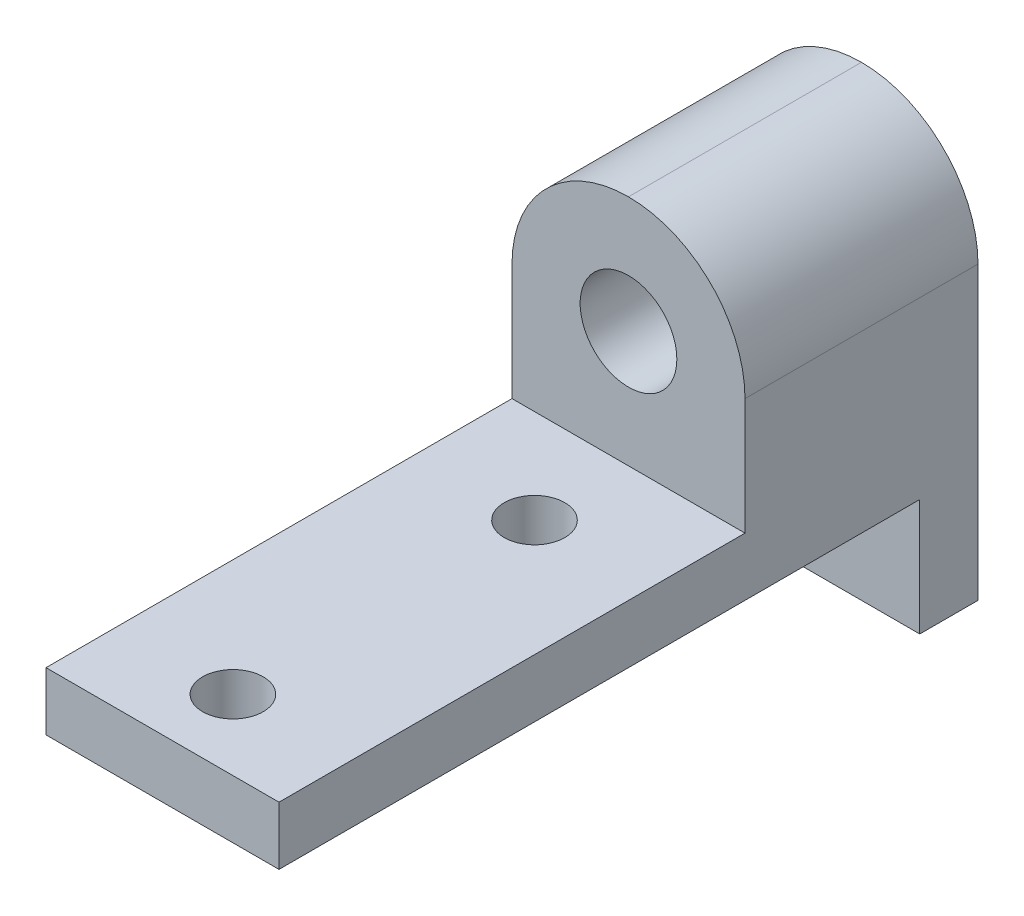
ISO-10303-21;
HEADER;
FILE_DESCRIPTION(('STEP AP214'),'2;1');
FILE_NAME('part.step','',(''),(''),'','','');
FILE_SCHEMA(('AUTOMOTIVE_DESIGN { 1 0 10303 214 1 1 1 1 }'));
ENDSEC;
DATA;
#1=APPLICATION_CONTEXT('core data for automotive mechanical design processes');
#2=APPLICATION_PROTOCOL_DEFINITION('international standard','automotive_design',2000,#1);
#3=PRODUCT_CONTEXT('',#1,'mechanical');
#4=PRODUCT('Part','Part','',(#3));
#5=PRODUCT_RELATED_PRODUCT_CATEGORY('part','',(#4));
#6=PRODUCT_DEFINITION_FORMATION('','',#4);
#7=PRODUCT_DEFINITION_CONTEXT('part definition',#1,'design');
#8=PRODUCT_DEFINITION('design','',#6,#7);
#9=PRODUCT_DEFINITION_SHAPE('','',#8);
#10=(LENGTH_UNIT() NAMED_UNIT(*) SI_UNIT(.MILLI.,.METRE.));
#11=(NAMED_UNIT(*) PLANE_ANGLE_UNIT() SI_UNIT($,.RADIAN.));
#12=(NAMED_UNIT(*) SI_UNIT($,.STERADIAN.) SOLID_ANGLE_UNIT());
#13=UNCERTAINTY_MEASURE_WITH_UNIT(LENGTH_MEASURE(1.E-05),#10,'distance_accuracy_value','');
#14=(GEOMETRIC_REPRESENTATION_CONTEXT(3) GLOBAL_UNCERTAINTY_ASSIGNED_CONTEXT((#13)) GLOBAL_UNIT_ASSIGNED_CONTEXT((#10,
#11,#12)) REPRESENTATION_CONTEXT('',''));
#15=CARTESIAN_POINT('',(0.,0.,0.));
#16=DIRECTION('',(0.,0.,1.));
#17=DIRECTION('',(1.,0.,0.));
#18=AXIS2_PLACEMENT_3D('',#15,#16,#17);
#19=CARTESIAN_POINT('',(0.,0.,0.));
#20=DIRECTION('',(0.,1.,0.));
#21=DIRECTION('',(0.,0.,1.));
#22=AXIS2_PLACEMENT_3D('',#19,#20,#21);
#23=PLANE('',#22);
#24=CARTESIAN_POINT('',(2.63414634146342,0.,46.221727325495));
#25=DIRECTION('',(0.,1.,0.));
#26=DIRECTION('',(0.,0.,1.));
#27=AXIS2_PLACEMENT_3D('',#24,#25,#26);
#28=CIRCLE('',#27,2.6);
#29=CARTESIAN_POINT('',(2.63414634146342,0.,48.821727325495));
#30=VERTEX_POINT('',#29);
#31=EDGE_CURVE('E135',#30,#30,#28,.T.);
#32=ORIENTED_EDGE('',*,*,#31,.T.);
#33=EDGE_LOOP('',(#32));
#34=FACE_BOUND('',#33,.T.);
#35=CARTESIAN_POINT('',(2.63414634146342,0.,72.1101674430074));
#36=DIRECTION('',(0.,1.,0.));
#37=DIRECTION('',(0.,0.,1.));
#38=AXIS2_PLACEMENT_3D('',#35,#36,#37);
#39=CIRCLE('',#38,2.6);
#40=CARTESIAN_POINT('',(2.63414634146342,0.,74.7101674430074));
#41=VERTEX_POINT('',#40);
#42=EDGE_CURVE('E138',#41,#41,#39,.T.);
#43=ORIENTED_EDGE('',*,*,#42,.T.);
#44=EDGE_LOOP('',(#43));
#45=FACE_BOUND('',#44,.T.);
#46=DIRECTION('',(-1.,0.,0.));
#47=VECTOR('',#46,1.);
#48=CARTESIAN_POINT('',(-7.36585365853658,0.,23.1541428107448));
#49=LINE('',#48,#47);
#50=CARTESIAN_POINT('',(12.6341463414634,0.,23.1541428107448));
#51=VERTEX_POINT('',#50);
#52=CARTESIAN_POINT('',(-7.36585365853658,0.,23.1541428107448));
#53=VERTEX_POINT('',#52);
#54=EDGE_CURVE('E53',#51,#53,#49,.T.);
#55=ORIENTED_EDGE('',*,*,#54,.F.);
#56=DIRECTION('',(0.,0.,-1.));
#57=VECTOR('',#56,1.);
#58=CARTESIAN_POINT('',(12.6341463414634,0.,8.15414281074482));
#59=LINE('',#58,#57);
#60=CARTESIAN_POINT('',(12.6341463414634,0.,78.1541428107448));
#61=VERTEX_POINT('',#60);
#62=EDGE_CURVE('E119',#61,#51,#59,.T.);
#63=ORIENTED_EDGE('',*,*,#62,.F.);
#64=DIRECTION('',(1.,0.,0.));
#65=VECTOR('',#64,1.);
#66=CARTESIAN_POINT('',(-7.36585365853658,0.,78.1541428107448));
#67=LINE('',#66,#65);
#68=CARTESIAN_POINT('',(-7.36585365853658,0.,78.1541428107448));
#69=VERTEX_POINT('',#68);
#70=EDGE_CURVE('E129',#69,#61,#67,.T.);
#71=ORIENTED_EDGE('',*,*,#70,.F.);
#72=DIRECTION('',(0.,0.,1.));
#73=VECTOR('',#72,1.);
#74=CARTESIAN_POINT('',(-7.36585365853658,0.,8.15414281074482));
#75=LINE('',#74,#73);
#76=EDGE_CURVE('E125',#53,#69,#75,.T.);
#77=ORIENTED_EDGE('',*,*,#76,.F.);
#78=EDGE_LOOP('',(#55,#63,#71,#77));
#79=FACE_BOUND('',#78,.T.);
#80=ADVANCED_FACE('F37',(#34,#45,#79),#23,.F.);
#81=CARTESIAN_POINT('',(-7.36585365853658,5.,8.15414281074482));
#82=DIRECTION('',(1.,0.,0.));
#83=DIRECTION('',(0.,0.,-1.));
#84=AXIS2_PLACEMENT_3D('',#81,#82,#83);
#85=PLANE('',#84);
#86=DIRECTION('',(0.,-1.,0.));
#87=VECTOR('',#86,1.);
#88=CARTESIAN_POINT('',(-7.36585365853658,25.,18.1541428107448));
#89=LINE('',#88,#87);
#90=CARTESIAN_POINT('',(-7.36585365853658,15.,18.1541428107448));
#91=VERTEX_POINT('',#90);
#92=CARTESIAN_POINT('',(-7.36585365853658,-10.,18.1541428107448));
#93=VERTEX_POINT('',#92);
#94=EDGE_CURVE('E171',#91,#93,#89,.T.);
#95=ORIENTED_EDGE('',*,*,#94,.T.);
#96=DIRECTION('',(0.,0.,-1.));
#97=VECTOR('',#96,1.);
#98=CARTESIAN_POINT('',(-7.36585365853658,-10.,18.1541428107448));
#99=LINE('',#98,#97);
#100=CARTESIAN_POINT('',(-7.36585365853658,-10.,23.1541428107448));
#101=VERTEX_POINT('',#100);
#102=EDGE_CURVE('E150',#101,#93,#99,.T.);
#103=ORIENTED_EDGE('',*,*,#102,.F.);
#104=DIRECTION('',(0.,1.,0.));
#105=VECTOR('',#104,1.);
#106=CARTESIAN_POINT('',(-7.36585365853658,-10.,23.1541428107448));
#107=LINE('',#106,#105);
#108=EDGE_CURVE('E160',#101,#53,#107,.T.);
#109=ORIENTED_EDGE('',*,*,#108,.T.);
#110=ORIENTED_EDGE('',*,*,#76,.T.);
#111=DIRECTION('',(0.,-1.,0.));
#112=VECTOR('',#111,1.);
#113=CARTESIAN_POINT('',(-7.36585365853658,5.,78.1541428107448));
#114=LINE('',#113,#112);
#115=CARTESIAN_POINT('',(-7.36585365853658,5.,78.1541428107448));
#116=VERTEX_POINT('',#115);
#117=EDGE_CURVE('E122',#116,#69,#114,.T.);
#118=ORIENTED_EDGE('',*,*,#117,.F.);
#119=DIRECTION('',(0.,0.,1.));
#120=VECTOR('',#119,1.);
#121=CARTESIAN_POINT('',(-7.36585365853658,5.,8.15414281074482));
#122=LINE('',#121,#120);
#123=CARTESIAN_POINT('',(-7.36585365853658,5.,38.1541428107448));
#124=VERTEX_POINT('',#123);
#125=EDGE_CURVE('E109',#124,#116,#122,.T.);
#126=ORIENTED_EDGE('',*,*,#125,.F.);
#127=DIRECTION('',(0.,-1.,0.));
#128=VECTOR('',#127,1.);
#129=CARTESIAN_POINT('',(-7.36585365853658,25.,38.1541428107448));
#130=LINE('',#129,#128);
#131=CARTESIAN_POINT('',(-7.36585365853658,15.,38.1541428107448));
#132=VERTEX_POINT('',#131);
#133=EDGE_CURVE('E177',#132,#124,#130,.T.);
#134=ORIENTED_EDGE('',*,*,#133,.F.);
#135=DIRECTION('',(0.,0.,1.));
#136=VECTOR('',#135,1.);
#137=CARTESIAN_POINT('',(-7.36585365853658,15.,18.1541428107448));
#138=LINE('',#137,#136);
#139=EDGE_CURVE('E11',#132,#91,#138,.F.);
#140=ORIENTED_EDGE('',*,*,#139,.T.);
#141=EDGE_LOOP('',(#95,#103,#109,#110,#118,#126,#134,#140));
#142=FACE_BOUND('',#141,.T.);
#143=ADVANCED_FACE('F123',(#142),#85,.F.);
#144=CARTESIAN_POINT('',(12.6341463414634,5.,8.15414281074482));
#145=DIRECTION('',(-1.,0.,0.));
#146=DIRECTION('',(0.,0.,1.));
#147=AXIS2_PLACEMENT_3D('',#144,#145,#146);
#148=PLANE('',#147);
#149=ORIENTED_EDGE('',*,*,#62,.T.);
#150=DIRECTION('',(0.,1.,0.));
#151=VECTOR('',#150,1.);
#152=CARTESIAN_POINT('',(12.6341463414634,-10.,23.1541428107448));
#153=LINE('',#152,#151);
#154=CARTESIAN_POINT('',(12.6341463414634,-10.,23.1541428107448));
#155=VERTEX_POINT('',#154);
#156=EDGE_CURVE('E163',#155,#51,#153,.T.);
#157=ORIENTED_EDGE('',*,*,#156,.F.);
#158=DIRECTION('',(0.,0.,1.));
#159=VECTOR('',#158,1.);
#160=CARTESIAN_POINT('',(12.6341463414634,-10.,18.1541428107448));
#161=LINE('',#160,#159);
#162=CARTESIAN_POINT('',(12.6341463414634,-10.,18.1541428107448));
#163=VERTEX_POINT('',#162);
#164=EDGE_CURVE('E156',#163,#155,#161,.T.);
#165=ORIENTED_EDGE('',*,*,#164,.F.);
#166=DIRECTION('',(0.,-1.,0.));
#167=VECTOR('',#166,1.);
#168=CARTESIAN_POINT('',(12.6341463414634,25.,18.1541428107448));
#169=LINE('',#168,#167);
#170=CARTESIAN_POINT('',(12.6341463414634,15.,18.1541428107448));
#171=VERTEX_POINT('',#170);
#172=EDGE_CURVE('E173',#171,#163,#169,.T.);
#173=ORIENTED_EDGE('',*,*,#172,.F.);
#174=DIRECTION('',(0.,0.,-1.));
#175=VECTOR('',#174,1.);
#176=CARTESIAN_POINT('',(12.6341463414634,15.,38.1541428107448));
#177=LINE('',#176,#175);
#178=CARTESIAN_POINT('',(12.6341463414634,15.,38.1541428107448));
#179=VERTEX_POINT('',#178);
#180=EDGE_CURVE('E188',#171,#179,#177,.F.);
#181=ORIENTED_EDGE('',*,*,#180,.T.);
#182=DIRECTION('',(0.,-1.,0.));
#183=VECTOR('',#182,1.);
#184=CARTESIAN_POINT('',(12.6341463414634,25.,38.1541428107448));
#185=LINE('',#184,#183);
#186=CARTESIAN_POINT('',(12.6341463414634,5.,38.1541428107448));
#187=VERTEX_POINT('',#186);
#188=EDGE_CURVE('E175',#179,#187,#185,.T.);
#189=ORIENTED_EDGE('',*,*,#188,.T.);
#190=DIRECTION('',(0.,0.,-1.));
#191=VECTOR('',#190,1.);
#192=CARTESIAN_POINT('',(12.6341463414634,5.,8.15414281074482));
#193=LINE('',#192,#191);
#194=CARTESIAN_POINT('',(12.6341463414634,5.,78.1541428107448));
#195=VERTEX_POINT('',#194);
#196=EDGE_CURVE('E118',#195,#187,#193,.T.);
#197=ORIENTED_EDGE('',*,*,#196,.F.);
#198=DIRECTION('',(0.,1.,0.));
#199=VECTOR('',#198,1.);
#200=CARTESIAN_POINT('',(12.6341463414634,0.,78.1541428107448));
#201=LINE('',#200,#199);
#202=EDGE_CURVE('E134',#61,#195,#201,.T.);
#203=ORIENTED_EDGE('',*,*,#202,.F.);
#204=EDGE_LOOP('',(#149,#157,#165,#173,#181,#189,#197,#203));
#205=FACE_BOUND('',#204,.T.);
#206=ADVANCED_FACE('F210',(#205),#148,.F.);
#207=CARTESIAN_POINT('',(0.,5.,0.));
#208=DIRECTION('',(0.,1.,0.));
#209=DIRECTION('',(0.,0.,1.));
#210=AXIS2_PLACEMENT_3D('',#207,#208,#209);
#211=PLANE('',#210);
#212=CARTESIAN_POINT('',(2.63414634146342,5.,46.221727325495));
#213=DIRECTION('',(0.,1.,0.));
#214=DIRECTION('',(0.,0.,1.));
#215=AXIS2_PLACEMENT_3D('',#212,#213,#214);
#216=CIRCLE('',#215,2.6);
#217=CARTESIAN_POINT('',(2.63414634146342,5.,48.821727325495));
#218=VERTEX_POINT('',#217);
#219=EDGE_CURVE('E255',#218,#218,#216,.T.);
#220=ORIENTED_EDGE('',*,*,#219,.F.);
#221=EDGE_LOOP('',(#220));
#222=FACE_BOUND('',#221,.T.);
#223=CARTESIAN_POINT('',(2.63414634146342,5.,72.1101674430074));
#224=DIRECTION('',(0.,1.,0.));
#225=DIRECTION('',(0.,0.,1.));
#226=AXIS2_PLACEMENT_3D('',#223,#224,#225);
#227=CIRCLE('',#226,2.6);
#228=CARTESIAN_POINT('',(2.63414634146342,5.,74.7101674430074));
#229=VERTEX_POINT('',#228);
#230=EDGE_CURVE('E258',#229,#229,#227,.T.);
#231=ORIENTED_EDGE('',*,*,#230,.F.);
#232=EDGE_LOOP('',(#231));
#233=FACE_BOUND('',#232,.T.);
#234=DIRECTION('',(1.,0.,0.));
#235=VECTOR('',#234,1.);
#236=CARTESIAN_POINT('',(-7.36585365853658,5.,38.1541428107448));
#237=LINE('',#236,#235);
#238=EDGE_CURVE('E116',#124,#187,#237,.T.);
#239=ORIENTED_EDGE('',*,*,#238,.F.);
#240=ORIENTED_EDGE('',*,*,#125,.T.);
#241=DIRECTION('',(-1.,0.,0.));
#242=VECTOR('',#241,1.);
#243=CARTESIAN_POINT('',(12.6341463414634,5.,78.1541428107448));
#244=LINE('',#243,#242);
#245=EDGE_CURVE('E114',#195,#116,#244,.T.);
#246=ORIENTED_EDGE('',*,*,#245,.F.);
#247=ORIENTED_EDGE('',*,*,#196,.T.);
#248=EDGE_LOOP('',(#239,#240,#246,#247));
#249=FACE_BOUND('',#248,.T.);
#250=ADVANCED_FACE('F111',(#222,#233,#249),#211,.T.);
#251=CARTESIAN_POINT('',(-7.36585365853658,25.,38.1541428107448));
#252=DIRECTION('',(0.,0.,-1.));
#253=DIRECTION('',(-1.,0.,0.));
#254=AXIS2_PLACEMENT_3D('',#251,#252,#253);
#255=PLANE('',#254);
#256=CARTESIAN_POINT('',(2.63414634146342,15.,38.1541428107448));
#257=DIRECTION('',(0.,0.,1.));
#258=DIRECTION('',(1.,0.,0.));
#259=AXIS2_PLACEMENT_3D('',#256,#257,#258);
#260=CIRCLE('',#259,4.15);
#261=CARTESIAN_POINT('',(6.78414634146342,15.,38.1541428107448));
#262=VERTEX_POINT('',#261);
#263=EDGE_CURVE('E166',#262,#262,#260,.T.);
#264=ORIENTED_EDGE('',*,*,#263,.F.);
#265=EDGE_LOOP('',(#264));
#266=FACE_BOUND('',#265,.T.);
#267=ORIENTED_EDGE('',*,*,#188,.F.);
#268=CARTESIAN_POINT('',(2.63414634146342,15.,38.1541428107448));
#269=DIRECTION('',(0.,0.,-1.));
#270=DIRECTION('',(-1.,0.,0.));
#271=AXIS2_PLACEMENT_3D('',#268,#269,#270);
#272=CIRCLE('',#271,10.);
#273=CARTESIAN_POINT('',(2.63414634146342,25.,38.1541428107448));
#274=VERTEX_POINT('',#273);
#275=EDGE_CURVE('E46',#179,#274,#272,.F.);
#276=ORIENTED_EDGE('',*,*,#275,.T.);
#277=CARTESIAN_POINT('',(2.63414634146342,15.,38.1541428107448));
#278=DIRECTION('',(0.,0.,-1.));
#279=DIRECTION('',(-1.,0.,0.));
#280=AXIS2_PLACEMENT_3D('',#277,#278,#279);
#281=CIRCLE('',#280,10.);
#282=EDGE_CURVE('E61',#274,#132,#281,.F.);
#283=ORIENTED_EDGE('',*,*,#282,.T.);
#284=ORIENTED_EDGE('',*,*,#133,.T.);
#285=ORIENTED_EDGE('',*,*,#238,.T.);
#286=EDGE_LOOP('',(#267,#276,#283,#284,#285));
#287=FACE_BOUND('',#286,.T.);
#288=ADVANCED_FACE('F193',(#266,#287),#255,.F.);
#289=CARTESIAN_POINT('',(-7.36585365853658,25.,18.1541428107448));
#290=DIRECTION('',(0.,0.,1.));
#291=DIRECTION('',(1.,0.,0.));
#292=AXIS2_PLACEMENT_3D('',#289,#290,#291);
#293=PLANE('',#292);
#294=CARTESIAN_POINT('',(2.63414634146342,-5.,18.1541428107448));
#295=DIRECTION('',(0.,0.,1.));
#296=DIRECTION('',(1.,0.,0.));
#297=AXIS2_PLACEMENT_3D('',#294,#295,#296);
#298=CIRCLE('',#297,1.6);
#299=CARTESIAN_POINT('',(4.23414634146342,-5.,18.1541428107448));
#300=VERTEX_POINT('',#299);
#301=EDGE_CURVE('E145',#300,#300,#298,.T.);
#302=ORIENTED_EDGE('',*,*,#301,.T.);
#303=EDGE_LOOP('',(#302));
#304=FACE_BOUND('',#303,.T.);
#305=CARTESIAN_POINT('',(2.63414634146342,15.,18.1541428107448));
#306=DIRECTION('',(0.,0.,1.));
#307=DIRECTION('',(1.,0.,0.));
#308=AXIS2_PLACEMENT_3D('',#305,#306,#307);
#309=CIRCLE('',#308,4.15);
#310=CARTESIAN_POINT('',(6.78414634146342,15.,18.1541428107448));
#311=VERTEX_POINT('',#310);
#312=EDGE_CURVE('E169',#311,#311,#309,.T.);
#313=ORIENTED_EDGE('',*,*,#312,.T.);
#314=EDGE_LOOP('',(#313));
#315=FACE_BOUND('',#314,.T.);
#316=CARTESIAN_POINT('',(2.63414634146342,15.,18.1541428107448));
#317=DIRECTION('',(0.,0.,1.));
#318=DIRECTION('',(1.,0.,0.));
#319=AXIS2_PLACEMENT_3D('',#316,#317,#318);
#320=CIRCLE('',#319,10.);
#321=CARTESIAN_POINT('',(2.63414634146342,25.,18.1541428107448));
#322=VERTEX_POINT('',#321);
#323=EDGE_CURVE('E180',#91,#322,#320,.F.);
#324=ORIENTED_EDGE('',*,*,#323,.T.);
#325=CARTESIAN_POINT('',(2.63414634146342,15.,18.1541428107448));
#326=DIRECTION('',(0.,0.,1.));
#327=DIRECTION('',(1.,0.,0.));
#328=AXIS2_PLACEMENT_3D('',#325,#326,#327);
#329=CIRCLE('',#328,10.);
#330=EDGE_CURVE('E186',#322,#171,#329,.F.);
#331=ORIENTED_EDGE('',*,*,#330,.T.);
#332=ORIENTED_EDGE('',*,*,#172,.T.);
#333=DIRECTION('',(1.,0.,0.));
#334=VECTOR('',#333,1.);
#335=CARTESIAN_POINT('',(-7.36585365853658,-10.,18.1541428107448));
#336=LINE('',#335,#334);
#337=EDGE_CURVE('E153',#93,#163,#336,.T.);
#338=ORIENTED_EDGE('',*,*,#337,.F.);
#339=ORIENTED_EDGE('',*,*,#94,.F.);
#340=EDGE_LOOP('',(#324,#331,#332,#338,#339));
#341=FACE_BOUND('',#340,.T.);
#342=ADVANCED_FACE('F205',(#304,#315,#341),#293,.F.);
#343=CARTESIAN_POINT('',(2.63414634146342,15.,8.15414281074482));
#344=DIRECTION('',(0.,0.,1.));
#345=DIRECTION('',(1.,0.,0.));
#346=AXIS2_PLACEMENT_3D('',#343,#344,#345);
#347=CYLINDRICAL_SURFACE('',#346,4.15);
#348=ORIENTED_EDGE('',*,*,#263,.T.);
#349=EDGE_LOOP('',(#348));
#350=FACE_BOUND('',#349,.T.);
#351=ORIENTED_EDGE('',*,*,#312,.F.);
#352=EDGE_LOOP('',(#351));
#353=FACE_BOUND('',#352,.T.);
#354=ADVANCED_FACE('F285',(#350,#353),#347,.F.);
#355=CARTESIAN_POINT('',(2.63414634146342,15.,0.));
#356=DIRECTION('',(0.,0.,-1.));
#357=DIRECTION('',(-1.,0.,0.));
#358=AXIS2_PLACEMENT_3D('',#355,#356,#357);
#359=CYLINDRICAL_SURFACE('',#358,10.);
#360=ORIENTED_EDGE('',*,*,#139,.F.);
#361=ORIENTED_EDGE('',*,*,#282,.F.);
#362=DIRECTION('',(0.,0.,1.));
#363=VECTOR('',#362,1.);
#364=CARTESIAN_POINT('',(2.63414634146342,25.,38.1541428107448));
#365=LINE('',#364,#363);
#366=EDGE_CURVE('E41',#322,#274,#365,.T.);
#367=ORIENTED_EDGE('',*,*,#366,.F.);
#368=ORIENTED_EDGE('',*,*,#323,.F.);
#369=EDGE_LOOP('',(#360,#361,#367,#368));
#370=FACE_BOUND('',#369,.T.);
#371=ADVANCED_FACE('F39',(#370),#359,.T.);
#372=CARTESIAN_POINT('',(2.63414634146342,15.,0.));
#373=DIRECTION('',(0.,0.,1.));
#374=DIRECTION('',(1.,0.,0.));
#375=AXIS2_PLACEMENT_3D('',#372,#373,#374);
#376=CYLINDRICAL_SURFACE('',#375,10.);
#377=ORIENTED_EDGE('',*,*,#275,.F.);
#378=ORIENTED_EDGE('',*,*,#180,.F.);
#379=ORIENTED_EDGE('',*,*,#330,.F.);
#380=ORIENTED_EDGE('',*,*,#366,.T.);
#381=EDGE_LOOP('',(#377,#378,#379,#380));
#382=FACE_BOUND('',#381,.T.);
#383=ADVANCED_FACE('F202',(#382),#376,.T.);
#384=CARTESIAN_POINT('',(-7.36585365853658,-10.,23.1541428107448));
#385=DIRECTION('',(0.,0.,-1.));
#386=DIRECTION('',(-1.,0.,0.));
#387=AXIS2_PLACEMENT_3D('',#384,#385,#386);
#388=PLANE('',#387);
#389=CARTESIAN_POINT('',(2.63414634146342,-5.,23.1541428107448));
#390=DIRECTION('',(0.,0.,1.));
#391=DIRECTION('',(1.,0.,0.));
#392=AXIS2_PLACEMENT_3D('',#389,#390,#391);
#393=CIRCLE('',#392,1.6);
#394=CARTESIAN_POINT('',(4.23414634146342,-5.,23.1541428107448));
#395=VERTEX_POINT('',#394);
#396=EDGE_CURVE('E144',#395,#395,#393,.T.);
#397=ORIENTED_EDGE('',*,*,#396,.F.);
#398=EDGE_LOOP('',(#397));
#399=FACE_BOUND('',#398,.T.);
#400=ORIENTED_EDGE('',*,*,#54,.T.);
#401=ORIENTED_EDGE('',*,*,#108,.F.);
#402=DIRECTION('',(-1.,0.,0.));
#403=VECTOR('',#402,1.);
#404=CARTESIAN_POINT('',(-7.36585365853658,-10.,23.1541428107448));
#405=LINE('',#404,#403);
#406=EDGE_CURVE('E158',#155,#101,#405,.T.);
#407=ORIENTED_EDGE('',*,*,#406,.F.);
#408=ORIENTED_EDGE('',*,*,#156,.T.);
#409=EDGE_LOOP('',(#400,#401,#407,#408));
#410=FACE_BOUND('',#409,.T.);
#411=ADVANCED_FACE('F218',(#399,#410),#388,.F.);
#412=CARTESIAN_POINT('',(0.,-10.,0.));
#413=DIRECTION('',(0.,1.,0.));
#414=DIRECTION('',(0.,0.,1.));
#415=AXIS2_PLACEMENT_3D('',#412,#413,#414);
#416=PLANE('',#415);
#417=ORIENTED_EDGE('',*,*,#102,.T.);
#418=ORIENTED_EDGE('',*,*,#337,.T.);
#419=ORIENTED_EDGE('',*,*,#164,.T.);
#420=ORIENTED_EDGE('',*,*,#406,.T.);
#421=EDGE_LOOP('',(#417,#418,#419,#420));
#422=FACE_BOUND('',#421,.T.);
#423=ADVANCED_FACE('F214',(#422),#416,.F.);
#424=CARTESIAN_POINT('',(2.63414634146342,-5.,18.1541428107448));
#425=DIRECTION('',(0.,0.,1.));
#426=DIRECTION('',(1.,0.,0.));
#427=AXIS2_PLACEMENT_3D('',#424,#425,#426);
#428=CYLINDRICAL_SURFACE('',#427,1.6);
#429=ORIENTED_EDGE('',*,*,#301,.F.);
#430=EDGE_LOOP('',(#429));
#431=FACE_BOUND('',#430,.T.);
#432=ORIENTED_EDGE('',*,*,#396,.T.);
#433=EDGE_LOOP('',(#432));
#434=FACE_BOUND('',#433,.T.);
#435=ADVANCED_FACE('F226',(#431,#434),#428,.F.);
#436=CARTESIAN_POINT('',(0.,0.,78.1541428107448));
#437=DIRECTION('',(0.,0.,1.));
#438=DIRECTION('',(1.,0.,0.));
#439=AXIS2_PLACEMENT_3D('',#436,#437,#438);
#440=PLANE('',#439);
#441=ORIENTED_EDGE('',*,*,#245,.T.);
#442=ORIENTED_EDGE('',*,*,#117,.T.);
#443=ORIENTED_EDGE('',*,*,#70,.T.);
#444=ORIENTED_EDGE('',*,*,#202,.T.);
#445=EDGE_LOOP('',(#441,#442,#443,#444));
#446=FACE_BOUND('',#445,.T.);
#447=ADVANCED_FACE('F132',(#446),#440,.T.);
#448=CARTESIAN_POINT('',(2.63414634146342,-10.,72.1101674430074));
#449=DIRECTION('',(0.,1.,0.));
#450=DIRECTION('',(0.,0.,1.));
#451=AXIS2_PLACEMENT_3D('',#448,#449,#450);
#452=CYLINDRICAL_SURFACE('',#451,2.6);
#453=ORIENTED_EDGE('',*,*,#230,.T.);
#454=EDGE_LOOP('',(#453));
#455=FACE_BOUND('',#454,.T.);
#456=ORIENTED_EDGE('',*,*,#42,.F.);
#457=EDGE_LOOP('',(#456));
#458=FACE_BOUND('',#457,.T.);
#459=ADVANCED_FACE('F265',(#455,#458),#452,.F.);
#460=CARTESIAN_POINT('',(2.63414634146342,-10.,46.221727325495));
#461=DIRECTION('',(0.,1.,0.));
#462=DIRECTION('',(0.,0.,1.));
#463=AXIS2_PLACEMENT_3D('',#460,#461,#462);
#464=CYLINDRICAL_SURFACE('',#463,2.6);
#465=ORIENTED_EDGE('',*,*,#219,.T.);
#466=EDGE_LOOP('',(#465));
#467=FACE_BOUND('',#466,.T.);
#468=ORIENTED_EDGE('',*,*,#31,.F.);
#469=EDGE_LOOP('',(#468));
#470=FACE_BOUND('',#469,.T.);
#471=ADVANCED_FACE('F267',(#467,#470),#464,.F.);
#472=CLOSED_SHELL('',(#80,#143,#206,#250,#288,#342,#354,#371,#383,#411,#423,#435,#447,#459,#471));
#473=MANIFOLD_SOLID_BREP('B2',#472);
#474=ADVANCED_BREP_SHAPE_REPRESENTATION('',(#18,#473),#14);
#475=SHAPE_DEFINITION_REPRESENTATION(#9,#474);
ENDSEC;
END-ISO-10303-21;
